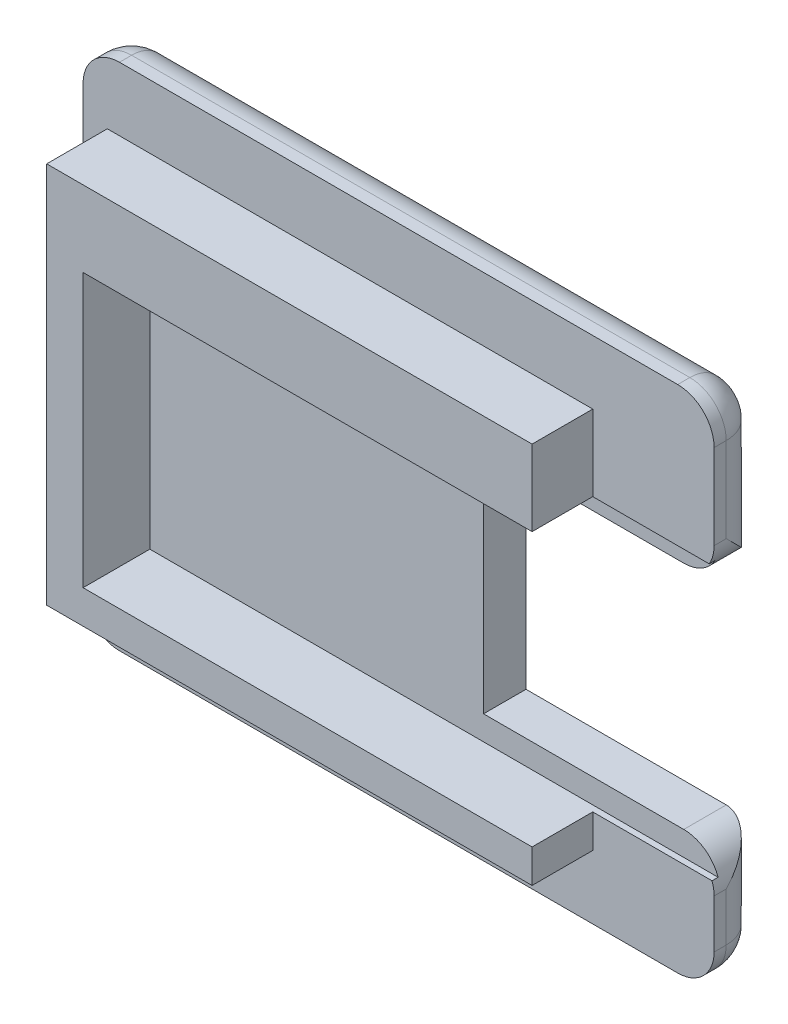
ISO-10303-21;
HEADER;
FILE_DESCRIPTION(('STEP AP214'),'2;1');
FILE_NAME('part.step','',(''),(''),'','','');
FILE_SCHEMA(('AUTOMOTIVE_DESIGN { 1 0 10303 214 1 1 1 1 }'));
ENDSEC;
DATA;
#1=APPLICATION_CONTEXT('core data for automotive mechanical design processes');
#2=APPLICATION_PROTOCOL_DEFINITION('international standard','automotive_design',2000,#1);
#3=PRODUCT_CONTEXT('',#1,'mechanical');
#4=PRODUCT('Part','Part','',(#3));
#5=PRODUCT_RELATED_PRODUCT_CATEGORY('part','',(#4));
#6=PRODUCT_DEFINITION_FORMATION('','',#4);
#7=PRODUCT_DEFINITION_CONTEXT('part definition',#1,'design');
#8=PRODUCT_DEFINITION('design','',#6,#7);
#9=PRODUCT_DEFINITION_SHAPE('','',#8);
#10=(LENGTH_UNIT() NAMED_UNIT(*) SI_UNIT(.MILLI.,.METRE.));
#11=(NAMED_UNIT(*) PLANE_ANGLE_UNIT() SI_UNIT($,.RADIAN.));
#12=(NAMED_UNIT(*) SI_UNIT($,.STERADIAN.) SOLID_ANGLE_UNIT());
#13=UNCERTAINTY_MEASURE_WITH_UNIT(LENGTH_MEASURE(1.E-05),#10,'distance_accuracy_value','');
#14=(GEOMETRIC_REPRESENTATION_CONTEXT(3) GLOBAL_UNCERTAINTY_ASSIGNED_CONTEXT((#13)) GLOBAL_UNIT_ASSIGNED_CONTEXT((#10,
#11,#12)) REPRESENTATION_CONTEXT('',''));
#15=CARTESIAN_POINT('',(0.,0.,0.));
#16=DIRECTION('',(0.,0.,1.));
#17=DIRECTION('',(1.,0.,0.));
#18=AXIS2_PLACEMENT_3D('',#15,#16,#17);
#19=CARTESIAN_POINT('',(26.,21.,4.));
#20=DIRECTION('',(-1.,0.,0.));
#21=DIRECTION('',(0.,0.,1.));
#22=AXIS2_PLACEMENT_3D('',#19,#20,#21);
#23=PLANE('',#22);
#24=DIRECTION('',(0.,1.,0.));
#25=VECTOR('',#24,1.);
#26=CARTESIAN_POINT('',(26.,21.,3.));
#27=LINE('',#26,#25);
#28=CARTESIAN_POINT('',(26.,-18.,3.));
#29=VERTEX_POINT('',#28);
#30=CARTESIAN_POINT('',(26.,-14.,3.));
#31=VERTEX_POINT('',#30);
#32=EDGE_CURVE('E364',#29,#31,#27,.T.);
#33=ORIENTED_EDGE('',*,*,#32,.T.);
#34=DIRECTION('',(0.,0.,1.));
#35=VECTOR('',#34,1.);
#36=CARTESIAN_POINT('',(26.,-14.,4.));
#37=LINE('',#36,#35);
#38=CARTESIAN_POINT('',(26.,-14.,4.));
#39=VERTEX_POINT('',#38);
#40=EDGE_CURVE('E366',#31,#39,#37,.T.);
#41=ORIENTED_EDGE('',*,*,#40,.T.);
#42=DIRECTION('',(0.,1.,0.));
#43=VECTOR('',#42,1.);
#44=CARTESIAN_POINT('',(26.,21.,4.));
#45=LINE('',#44,#43);
#46=CARTESIAN_POINT('',(26.,-18.,4.));
#47=VERTEX_POINT('',#46);
#48=EDGE_CURVE('E313',#47,#39,#45,.T.);
#49=ORIENTED_EDGE('',*,*,#48,.F.);
#50=DIRECTION('',(0.,0.,-1.));
#51=VECTOR('',#50,1.);
#52=CARTESIAN_POINT('',(26.,-18.,4.));
#53=LINE('',#52,#51);
#54=EDGE_CURVE('E362',#47,#29,#53,.T.);
#55=ORIENTED_EDGE('',*,*,#54,.T.);
#56=EDGE_LOOP('',(#33,#41,#49,#55));
#57=FACE_BOUND('',#56,.T.);
#58=ADVANCED_FACE('F41',(#57),#23,.F.);
#59=CARTESIAN_POINT('',(16.,15.75,9.));
#60=DIRECTION('',(-1.,0.,0.));
#61=DIRECTION('',(0.,-1.,0.));
#62=AXIS2_PLACEMENT_3D('',#59,#60,#61);
#63=PLANE('',#62);
#64=DIRECTION('',(0.,1.,0.));
#65=VECTOR('',#64,1.);
#66=CARTESIAN_POINT('',(16.,15.75,4.));
#67=LINE('',#66,#65);
#68=CARTESIAN_POINT('',(16.,-15.75,4.));
#69=VERTEX_POINT('',#68);
#70=CARTESIAN_POINT('',(16.,-13.,4.));
#71=VERTEX_POINT('',#70);
#72=EDGE_CURVE('E289',#69,#71,#67,.T.);
#73=ORIENTED_EDGE('',*,*,#72,.T.);
#74=DIRECTION('',(0.,0.,1.));
#75=VECTOR('',#74,1.);
#76=CARTESIAN_POINT('',(16.,-13.,9.));
#77=LINE('',#76,#75);
#78=CARTESIAN_POINT('',(16.,-13.,9.));
#79=VERTEX_POINT('',#78);
#80=EDGE_CURVE('E271',#71,#79,#77,.T.);
#81=ORIENTED_EDGE('',*,*,#80,.T.);
#82=DIRECTION('',(0.,1.,0.));
#83=VECTOR('',#82,1.);
#84=CARTESIAN_POINT('',(16.,15.75,9.));
#85=LINE('',#84,#83);
#86=CARTESIAN_POINT('',(16.,-15.75,9.));
#87=VERTEX_POINT('',#86);
#88=EDGE_CURVE('E278',#87,#79,#85,.T.);
#89=ORIENTED_EDGE('',*,*,#88,.F.);
#90=DIRECTION('',(0.,0.,-1.));
#91=VECTOR('',#90,1.);
#92=CARTESIAN_POINT('',(16.,-15.75,9.));
#93=LINE('',#92,#91);
#94=EDGE_CURVE('E288',#87,#69,#93,.T.);
#95=ORIENTED_EDGE('',*,*,#94,.T.);
#96=EDGE_LOOP('',(#73,#81,#89,#95));
#97=FACE_BOUND('',#96,.T.);
#98=ADVANCED_FACE('F478',(#97),#63,.F.);
#99=DIRECTION('',(0.,1.,0.));
#100=VECTOR('',#99,1.);
#101=CARTESIAN_POINT('',(26.,21.,3.));
#102=LINE('',#101,#100);
#103=CARTESIAN_POINT('',(26.,11.,3.));
#104=VERTEX_POINT('',#103);
#105=CARTESIAN_POINT('',(26.,18.,3.));
#106=VERTEX_POINT('',#105);
#107=EDGE_CURVE('E336',#104,#106,#102,.T.);
#108=ORIENTED_EDGE('',*,*,#107,.T.);
#109=DIRECTION('',(0.,0.,-1.));
#110=VECTOR('',#109,1.);
#111=CARTESIAN_POINT('',(26.,18.,4.));
#112=LINE('',#111,#110);
#113=CARTESIAN_POINT('',(26.,18.,4.));
#114=VERTEX_POINT('',#113);
#115=EDGE_CURVE('E338',#106,#114,#112,.F.);
#116=ORIENTED_EDGE('',*,*,#115,.T.);
#117=CARTESIAN_POINT('',(26.,11.,4.));
#118=VERTEX_POINT('',#117);
#119=EDGE_CURVE('E312',#118,#114,#45,.T.);
#120=ORIENTED_EDGE('',*,*,#119,.F.);
#121=DIRECTION('',(0.,0.,1.));
#122=VECTOR('',#121,1.);
#123=CARTESIAN_POINT('',(26.,11.,4.));
#124=LINE('',#123,#122);
#125=EDGE_CURVE('E334',#118,#104,#124,.F.);
#126=ORIENTED_EDGE('',*,*,#125,.T.);
#127=EDGE_LOOP('',(#108,#116,#120,#126));
#128=FACE_BOUND('',#127,.T.);
#129=ADVANCED_FACE('F480',(#128),#23,.F.);
#130=CARTESIAN_POINT('',(-26.,21.,4.));
#131=DIRECTION('',(0.,-1.,0.));
#132=DIRECTION('',(0.,0.,-1.));
#133=AXIS2_PLACEMENT_3D('',#130,#131,#132);
#134=PLANE('',#133);
#135=DIRECTION('',(-1.,0.,0.));
#136=VECTOR('',#135,1.);
#137=CARTESIAN_POINT('',(-26.,21.,4.));
#138=LINE('',#137,#136);
#139=CARTESIAN_POINT('',(23.,21.,4.));
#140=VERTEX_POINT('',#139);
#141=CARTESIAN_POINT('',(-23.,21.,4.));
#142=VERTEX_POINT('',#141);
#143=EDGE_CURVE('E316',#140,#142,#138,.T.);
#144=ORIENTED_EDGE('',*,*,#143,.F.);
#145=DIRECTION('',(0.,0.,-1.));
#146=VECTOR('',#145,1.);
#147=CARTESIAN_POINT('',(23.,21.,4.));
#148=LINE('',#147,#146);
#149=CARTESIAN_POINT('',(23.,21.,3.));
#150=VERTEX_POINT('',#149);
#151=EDGE_CURVE('E331',#140,#150,#148,.T.);
#152=ORIENTED_EDGE('',*,*,#151,.T.);
#153=DIRECTION('',(-1.,0.,0.));
#154=VECTOR('',#153,1.);
#155=CARTESIAN_POINT('',(-26.,21.,3.));
#156=LINE('',#155,#154);
#157=CARTESIAN_POINT('',(-23.,21.,3.));
#158=VERTEX_POINT('',#157);
#159=EDGE_CURVE('E329',#150,#158,#156,.T.);
#160=ORIENTED_EDGE('',*,*,#159,.T.);
#161=DIRECTION('',(0.,0.,-1.));
#162=VECTOR('',#161,1.);
#163=CARTESIAN_POINT('',(-23.,21.,4.));
#164=LINE('',#163,#162);
#165=EDGE_CURVE('E327',#158,#142,#164,.F.);
#166=ORIENTED_EDGE('',*,*,#165,.T.);
#167=EDGE_LOOP('',(#144,#152,#160,#166));
#168=FACE_BOUND('',#167,.T.);
#169=ADVANCED_FACE('F490',(#168),#134,.F.);
#170=CARTESIAN_POINT('',(-26.,21.,4.));
#171=DIRECTION('',(1.,0.,0.));
#172=DIRECTION('',(0.,1.,0.));
#173=AXIS2_PLACEMENT_3D('',#170,#171,#172);
#174=PLANE('',#173);
#175=DIRECTION('',(0.,-1.,0.));
#176=VECTOR('',#175,1.);
#177=CARTESIAN_POINT('',(-26.,21.,3.));
#178=LINE('',#177,#176);
#179=CARTESIAN_POINT('',(-26.,18.,3.));
#180=VERTEX_POINT('',#179);
#181=CARTESIAN_POINT('',(-26.,-18.,3.));
#182=VERTEX_POINT('',#181);
#183=EDGE_CURVE('E50',#180,#182,#178,.T.);
#184=ORIENTED_EDGE('',*,*,#183,.T.);
#185=DIRECTION('',(0.,0.,-1.));
#186=VECTOR('',#185,1.);
#187=CARTESIAN_POINT('',(-26.,-18.,4.));
#188=LINE('',#187,#186);
#189=CARTESIAN_POINT('',(-26.,-18.,4.));
#190=VERTEX_POINT('',#189);
#191=EDGE_CURVE('E11',#182,#190,#188,.F.);
#192=ORIENTED_EDGE('',*,*,#191,.T.);
#193=DIRECTION('',(0.,-1.,0.));
#194=VECTOR('',#193,1.);
#195=CARTESIAN_POINT('',(-26.,21.,4.));
#196=LINE('',#195,#194);
#197=CARTESIAN_POINT('',(-26.,18.,4.));
#198=VERTEX_POINT('',#197);
#199=EDGE_CURVE('E319',#198,#190,#196,.T.);
#200=ORIENTED_EDGE('',*,*,#199,.F.);
#201=DIRECTION('',(0.,0.,-1.));
#202=VECTOR('',#201,1.);
#203=CARTESIAN_POINT('',(-26.,18.,4.));
#204=LINE('',#203,#202);
#205=EDGE_CURVE('E61',#198,#180,#204,.T.);
#206=ORIENTED_EDGE('',*,*,#205,.T.);
#207=EDGE_LOOP('',(#184,#192,#200,#206));
#208=FACE_BOUND('',#207,.T.);
#209=ADVANCED_FACE('F495',(#208),#174,.F.);
#210=CARTESIAN_POINT('',(-26.,-21.,4.));
#211=DIRECTION('',(0.,1.,0.));
#212=DIRECTION('',(0.,0.,1.));
#213=AXIS2_PLACEMENT_3D('',#210,#211,#212);
#214=PLANE('',#213);
#215=DIRECTION('',(1.,0.,0.));
#216=VECTOR('',#215,1.);
#217=CARTESIAN_POINT('',(-26.,-21.,3.));
#218=LINE('',#217,#216);
#219=CARTESIAN_POINT('',(-23.,-21.,3.));
#220=VERTEX_POINT('',#219);
#221=CARTESIAN_POINT('',(23.,-21.,3.));
#222=VERTEX_POINT('',#221);
#223=EDGE_CURVE('E379',#220,#222,#218,.T.);
#224=ORIENTED_EDGE('',*,*,#223,.T.);
#225=DIRECTION('',(0.,0.,-1.));
#226=VECTOR('',#225,1.);
#227=CARTESIAN_POINT('',(23.,-21.,4.));
#228=LINE('',#227,#226);
#229=CARTESIAN_POINT('',(23.,-21.,4.));
#230=VERTEX_POINT('',#229);
#231=EDGE_CURVE('E383',#222,#230,#228,.F.);
#232=ORIENTED_EDGE('',*,*,#231,.T.);
#233=DIRECTION('',(1.,0.,0.));
#234=VECTOR('',#233,1.);
#235=CARTESIAN_POINT('',(-26.,-21.,4.));
#236=LINE('',#235,#234);
#237=CARTESIAN_POINT('',(-23.,-21.,4.));
#238=VERTEX_POINT('',#237);
#239=EDGE_CURVE('E322',#238,#230,#236,.T.);
#240=ORIENTED_EDGE('',*,*,#239,.F.);
#241=DIRECTION('',(0.,0.,-1.));
#242=VECTOR('',#241,1.);
#243=CARTESIAN_POINT('',(-23.,-21.,4.));
#244=LINE('',#243,#242);
#245=EDGE_CURVE('E381',#238,#220,#244,.T.);
#246=ORIENTED_EDGE('',*,*,#245,.T.);
#247=EDGE_LOOP('',(#224,#232,#240,#246));
#248=FACE_BOUND('',#247,.T.);
#249=ADVANCED_FACE('F537',(#248),#214,.F.);
#250=CARTESIAN_POINT('',(0.,0.,4.));
#251=DIRECTION('',(0.,0.,1.));
#252=DIRECTION('',(1.,0.,0.));
#253=AXIS2_PLACEMENT_3D('',#250,#251,#252);
#254=PLANE('',#253);
#255=ORIENTED_EDGE('',*,*,#119,.T.);
#256=CARTESIAN_POINT('',(23.,18.,4.));
#257=DIRECTION('',(0.,0.,1.));
#258=DIRECTION('',(1.,0.,0.));
#259=AXIS2_PLACEMENT_3D('',#256,#257,#258);
#260=CIRCLE('',#259,3.);
#261=EDGE_CURVE('E350',#114,#140,#260,.T.);
#262=ORIENTED_EDGE('',*,*,#261,.T.);
#263=ORIENTED_EDGE('',*,*,#143,.T.);
#264=CARTESIAN_POINT('',(-23.,18.,4.));
#265=DIRECTION('',(0.,0.,1.));
#266=DIRECTION('',(1.,0.,0.));
#267=AXIS2_PLACEMENT_3D('',#264,#265,#266);
#268=CIRCLE('',#267,3.);
#269=EDGE_CURVE('E340',#142,#198,#268,.T.);
#270=ORIENTED_EDGE('',*,*,#269,.T.);
#271=ORIENTED_EDGE('',*,*,#199,.T.);
#272=CARTESIAN_POINT('',(-23.,-18.,4.));
#273=DIRECTION('',(0.,0.,1.));
#274=DIRECTION('',(1.,0.,0.));
#275=AXIS2_PLACEMENT_3D('',#272,#273,#274);
#276=CIRCLE('',#275,3.);
#277=EDGE_CURVE('E342',#190,#238,#276,.T.);
#278=ORIENTED_EDGE('',*,*,#277,.T.);
#279=ORIENTED_EDGE('',*,*,#239,.T.);
#280=CARTESIAN_POINT('',(23.,-18.,4.));
#281=DIRECTION('',(0.,0.,1.));
#282=DIRECTION('',(1.,0.,0.));
#283=AXIS2_PLACEMENT_3D('',#280,#281,#282);
#284=CIRCLE('',#283,3.);
#285=EDGE_CURVE('E344',#230,#47,#284,.T.);
#286=ORIENTED_EDGE('',*,*,#285,.T.);
#287=ORIENTED_EDGE('',*,*,#48,.T.);
#288=CARTESIAN_POINT('',(23.,-14.,4.));
#289=DIRECTION('',(0.,0.,1.));
#290=DIRECTION('',(1.,0.,0.));
#291=AXIS2_PLACEMENT_3D('',#288,#289,#290);
#292=CIRCLE('',#291,3.);
#293=CARTESIAN_POINT('',(25.8284271247462,-13.,4.));
#294=VERTEX_POINT('',#293);
#295=EDGE_CURVE('E346',#39,#294,#292,.T.);
#296=ORIENTED_EDGE('',*,*,#295,.T.);
#297=DIRECTION('',(1.,0.,0.));
#298=VECTOR('',#297,1.);
#299=CARTESIAN_POINT('',(0.,-13.,4.));
#300=LINE('',#299,#298);
#301=EDGE_CURVE('E274',#71,#294,#300,.T.);
#302=ORIENTED_EDGE('',*,*,#301,.F.);
#303=ORIENTED_EDGE('',*,*,#72,.F.);
#304=DIRECTION('',(1.,0.,0.));
#305=VECTOR('',#304,1.);
#306=CARTESIAN_POINT('',(-24.,-15.75,4.));
#307=LINE('',#306,#305);
#308=CARTESIAN_POINT('',(-24.,-15.75,4.));
#309=VERTEX_POINT('',#308);
#310=EDGE_CURVE('E298',#309,#69,#307,.T.);
#311=ORIENTED_EDGE('',*,*,#310,.F.);
#312=DIRECTION('',(0.,-1.,0.));
#313=VECTOR('',#312,1.);
#314=CARTESIAN_POINT('',(-24.,15.75,4.));
#315=LINE('',#314,#313);
#316=CARTESIAN_POINT('',(-24.,15.75,4.));
#317=VERTEX_POINT('',#316);
#318=EDGE_CURVE('E295',#317,#309,#315,.T.);
#319=ORIENTED_EDGE('',*,*,#318,.F.);
#320=DIRECTION('',(-1.,0.,0.));
#321=VECTOR('',#320,1.);
#322=CARTESIAN_POINT('',(-24.,15.75,4.));
#323=LINE('',#322,#321);
#324=CARTESIAN_POINT('',(16.,15.75,4.));
#325=VERTEX_POINT('',#324);
#326=EDGE_CURVE('E292',#325,#317,#323,.T.);
#327=ORIENTED_EDGE('',*,*,#326,.F.);
#328=CARTESIAN_POINT('',(16.,9.5,4.));
#329=VERTEX_POINT('',#328);
#330=EDGE_CURVE('E277',#329,#325,#67,.T.);
#331=ORIENTED_EDGE('',*,*,#330,.F.);
#332=DIRECTION('',(-1.,0.,0.));
#333=VECTOR('',#332,1.);
#334=CARTESIAN_POINT('',(0.,9.5,4.));
#335=LINE('',#334,#333);
#336=CARTESIAN_POINT('',(25.5980762113533,9.5,4.));
#337=VERTEX_POINT('',#336);
#338=EDGE_CURVE('E269',#337,#329,#335,.T.);
#339=ORIENTED_EDGE('',*,*,#338,.F.);
#340=CARTESIAN_POINT('',(23.,11.,4.));
#341=DIRECTION('',(0.,0.,1.));
#342=DIRECTION('',(1.,0.,0.));
#343=AXIS2_PLACEMENT_3D('',#340,#341,#342);
#344=CIRCLE('',#343,3.);
#345=EDGE_CURVE('E348',#337,#118,#344,.T.);
#346=ORIENTED_EDGE('',*,*,#345,.T.);
#347=EDGE_LOOP('',(#255,#262,#263,#270,#271,#278,#279,#286,#287,#296,#302,#303,#311,#319,#327,
#331,#339,#346));
#348=FACE_BOUND('',#347,.T.);
#349=ADVANCED_FACE('F444',(#348),#254,.T.);
#350=CARTESIAN_POINT('',(0.,0.,0.));
#351=DIRECTION('',(0.,0.,1.));
#352=DIRECTION('',(1.,0.,0.));
#353=AXIS2_PLACEMENT_3D('',#350,#351,#352);
#354=PLANE('',#353);
#355=DIRECTION('',(-1.,0.,0.));
#356=VECTOR('',#355,1.);
#357=CARTESIAN_POINT('',(0.,18.,0.));
#358=LINE('',#357,#356);
#359=CARTESIAN_POINT('',(-23.,18.,0.));
#360=VERTEX_POINT('',#359);
#361=CARTESIAN_POINT('',(23.,18.,0.));
#362=VERTEX_POINT('',#361);
#363=EDGE_CURVE('E358',#360,#362,#358,.F.);
#364=ORIENTED_EDGE('',*,*,#363,.T.);
#365=DIRECTION('',(0.,1.,0.));
#366=VECTOR('',#365,1.);
#367=CARTESIAN_POINT('',(23.,0.,0.));
#368=LINE('',#367,#366);
#369=CARTESIAN_POINT('',(23.,8.,0.));
#370=VERTEX_POINT('',#369);
#371=EDGE_CURVE('E360',#362,#370,#368,.F.);
#372=ORIENTED_EDGE('',*,*,#371,.T.);
#373=DIRECTION('',(-1.,0.,0.));
#374=VECTOR('',#373,1.);
#375=CARTESIAN_POINT('',(0.,8.,0.));
#376=LINE('',#375,#374);
#377=CARTESIAN_POINT('',(6.50000000000001,8.,0.));
#378=VERTEX_POINT('',#377);
#379=EDGE_CURVE('E241',#370,#378,#376,.T.);
#380=ORIENTED_EDGE('',*,*,#379,.T.);
#381=DIRECTION('',(0.,-1.,0.));
#382=VECTOR('',#381,1.);
#383=CARTESIAN_POINT('',(6.50000000000001,0.,0.));
#384=LINE('',#383,#382);
#385=CARTESIAN_POINT('',(6.50000000000001,-11.,0.));
#386=VERTEX_POINT('',#385);
#387=EDGE_CURVE('E232',#378,#386,#384,.T.);
#388=ORIENTED_EDGE('',*,*,#387,.T.);
#389=DIRECTION('',(1.,0.,0.));
#390=VECTOR('',#389,1.);
#391=CARTESIAN_POINT('',(0.,-11.,0.));
#392=LINE('',#391,#390);
#393=CARTESIAN_POINT('',(23.,-11.,0.));
#394=VERTEX_POINT('',#393);
#395=EDGE_CURVE('E245',#386,#394,#392,.T.);
#396=ORIENTED_EDGE('',*,*,#395,.T.);
#397=DIRECTION('',(0.,1.,0.));
#398=VECTOR('',#397,1.);
#399=CARTESIAN_POINT('',(23.,0.,0.));
#400=LINE('',#399,#398);
#401=CARTESIAN_POINT('',(23.,-18.,0.));
#402=VERTEX_POINT('',#401);
#403=EDGE_CURVE('E356',#394,#402,#400,.F.);
#404=ORIENTED_EDGE('',*,*,#403,.T.);
#405=DIRECTION('',(1.,0.,0.));
#406=VECTOR('',#405,1.);
#407=CARTESIAN_POINT('',(0.,-18.,0.));
#408=LINE('',#407,#406);
#409=CARTESIAN_POINT('',(-23.,-18.,0.));
#410=VERTEX_POINT('',#409);
#411=EDGE_CURVE('E354',#402,#410,#408,.F.);
#412=ORIENTED_EDGE('',*,*,#411,.T.);
#413=DIRECTION('',(0.,-1.,0.));
#414=VECTOR('',#413,1.);
#415=CARTESIAN_POINT('',(-23.,0.,0.));
#416=LINE('',#415,#414);
#417=EDGE_CURVE('E352',#410,#360,#416,.F.);
#418=ORIENTED_EDGE('',*,*,#417,.T.);
#419=EDGE_LOOP('',(#364,#372,#380,#388,#396,#404,#412,#418));
#420=FACE_BOUND('',#419,.T.);
#421=ADVANCED_FACE('F459',(#420),#354,.F.);
#422=CARTESIAN_POINT('',(16.,9.5,9.));
#423=VERTEX_POINT('',#422);
#424=CARTESIAN_POINT('',(16.,15.75,9.));
#425=VERTEX_POINT('',#424);
#426=EDGE_CURVE('E282',#423,#425,#85,.T.);
#427=ORIENTED_EDGE('',*,*,#426,.F.);
#428=DIRECTION('',(0.,0.,-1.));
#429=VECTOR('',#428,1.);
#430=CARTESIAN_POINT('',(16.,9.5,9.));
#431=LINE('',#430,#429);
#432=EDGE_CURVE('E264',#423,#329,#431,.T.);
#433=ORIENTED_EDGE('',*,*,#432,.T.);
#434=ORIENTED_EDGE('',*,*,#330,.T.);
#435=DIRECTION('',(0.,0.,-1.));
#436=VECTOR('',#435,1.);
#437=CARTESIAN_POINT('',(16.,15.75,9.));
#438=LINE('',#437,#436);
#439=EDGE_CURVE('E309',#425,#325,#438,.T.);
#440=ORIENTED_EDGE('',*,*,#439,.F.);
#441=EDGE_LOOP('',(#427,#433,#434,#440));
#442=FACE_BOUND('',#441,.T.);
#443=ADVANCED_FACE('F487',(#442),#63,.F.);
#444=CARTESIAN_POINT('',(-24.,15.75,9.));
#445=DIRECTION('',(0.,-1.,0.));
#446=DIRECTION('',(0.,0.,-1.));
#447=AXIS2_PLACEMENT_3D('',#444,#445,#446);
#448=PLANE('',#447);
#449=ORIENTED_EDGE('',*,*,#326,.T.);
#450=DIRECTION('',(0.,0.,-1.));
#451=VECTOR('',#450,1.);
#452=CARTESIAN_POINT('',(-24.,15.75,9.));
#453=LINE('',#452,#451);
#454=CARTESIAN_POINT('',(-24.,15.75,9.));
#455=VERTEX_POINT('',#454);
#456=EDGE_CURVE('E306',#455,#317,#453,.T.);
#457=ORIENTED_EDGE('',*,*,#456,.F.);
#458=DIRECTION('',(-1.,0.,0.));
#459=VECTOR('',#458,1.);
#460=CARTESIAN_POINT('',(-24.,15.75,9.));
#461=LINE('',#460,#459);
#462=EDGE_CURVE('E281',#425,#455,#461,.T.);
#463=ORIENTED_EDGE('',*,*,#462,.F.);
#464=ORIENTED_EDGE('',*,*,#439,.T.);
#465=EDGE_LOOP('',(#449,#457,#463,#464));
#466=FACE_BOUND('',#465,.T.);
#467=ADVANCED_FACE('F550',(#466),#448,.F.);
#468=CARTESIAN_POINT('',(-24.,15.75,9.));
#469=DIRECTION('',(1.,0.,0.));
#470=DIRECTION('',(0.,1.,0.));
#471=AXIS2_PLACEMENT_3D('',#468,#469,#470);
#472=PLANE('',#471);
#473=ORIENTED_EDGE('',*,*,#318,.T.);
#474=DIRECTION('',(0.,0.,-1.));
#475=VECTOR('',#474,1.);
#476=CARTESIAN_POINT('',(-24.,-15.75,9.));
#477=LINE('',#476,#475);
#478=CARTESIAN_POINT('',(-24.,-15.75,9.));
#479=VERTEX_POINT('',#478);
#480=EDGE_CURVE('E303',#479,#309,#477,.T.);
#481=ORIENTED_EDGE('',*,*,#480,.F.);
#482=DIRECTION('',(0.,-1.,0.));
#483=VECTOR('',#482,1.);
#484=CARTESIAN_POINT('',(-24.,15.75,9.));
#485=LINE('',#484,#483);
#486=EDGE_CURVE('E284',#455,#479,#485,.T.);
#487=ORIENTED_EDGE('',*,*,#486,.F.);
#488=ORIENTED_EDGE('',*,*,#456,.T.);
#489=EDGE_LOOP('',(#473,#481,#487,#488));
#490=FACE_BOUND('',#489,.T.);
#491=ADVANCED_FACE('F554',(#490),#472,.F.);
#492=CARTESIAN_POINT('',(-24.,-15.75,9.));
#493=DIRECTION('',(0.,1.,0.));
#494=DIRECTION('',(0.,0.,1.));
#495=AXIS2_PLACEMENT_3D('',#492,#493,#494);
#496=PLANE('',#495);
#497=ORIENTED_EDGE('',*,*,#310,.T.);
#498=ORIENTED_EDGE('',*,*,#94,.F.);
#499=DIRECTION('',(1.,0.,0.));
#500=VECTOR('',#499,1.);
#501=CARTESIAN_POINT('',(-24.,-15.75,9.));
#502=LINE('',#501,#500);
#503=EDGE_CURVE('E286',#479,#87,#502,.T.);
#504=ORIENTED_EDGE('',*,*,#503,.F.);
#505=ORIENTED_EDGE('',*,*,#480,.T.);
#506=EDGE_LOOP('',(#497,#498,#504,#505));
#507=FACE_BOUND('',#506,.T.);
#508=ADVANCED_FACE('F558',(#507),#496,.F.);
#509=CARTESIAN_POINT('',(0.,0.,9.));
#510=DIRECTION('',(0.,0.,1.));
#511=DIRECTION('',(1.,0.,0.));
#512=AXIS2_PLACEMENT_3D('',#509,#510,#511);
#513=PLANE('',#512);
#514=DIRECTION('',(1.,0.,0.));
#515=VECTOR('',#514,1.);
#516=CARTESIAN_POINT('',(-21.,-13.,9.));
#517=LINE('',#516,#515);
#518=CARTESIAN_POINT('',(-21.,-13.,9.));
#519=VERTEX_POINT('',#518);
#520=EDGE_CURVE('E252',#519,#79,#517,.T.);
#521=ORIENTED_EDGE('',*,*,#520,.F.);
#522=DIRECTION('',(0.,-1.,0.));
#523=VECTOR('',#522,1.);
#524=CARTESIAN_POINT('',(-21.,9.5,9.));
#525=LINE('',#524,#523);
#526=CARTESIAN_POINT('',(-21.,9.5,9.));
#527=VERTEX_POINT('',#526);
#528=EDGE_CURVE('E248',#527,#519,#525,.T.);
#529=ORIENTED_EDGE('',*,*,#528,.F.);
#530=DIRECTION('',(-1.,0.,0.));
#531=VECTOR('',#530,1.);
#532=CARTESIAN_POINT('',(0.,9.5,9.));
#533=LINE('',#532,#531);
#534=EDGE_CURVE('E325',#423,#527,#533,.T.);
#535=ORIENTED_EDGE('',*,*,#534,.F.);
#536=ORIENTED_EDGE('',*,*,#426,.T.);
#537=ORIENTED_EDGE('',*,*,#462,.T.);
#538=ORIENTED_EDGE('',*,*,#486,.T.);
#539=ORIENTED_EDGE('',*,*,#503,.T.);
#540=ORIENTED_EDGE('',*,*,#88,.T.);
#541=EDGE_LOOP('',(#521,#529,#535,#536,#537,#538,#539,#540));
#542=FACE_BOUND('',#541,.T.);
#543=ADVANCED_FACE('F562',(#542),#513,.T.);
#544=CARTESIAN_POINT('',(0.,0.,3.5));
#545=DIRECTION('',(0.,0.,1.));
#546=DIRECTION('',(1.,0.,0.));
#547=AXIS2_PLACEMENT_3D('',#544,#545,#546);
#548=PLANE('',#547);
#549=DIRECTION('',(-1.,0.,0.));
#550=VECTOR('',#549,1.);
#551=CARTESIAN_POINT('',(6.50000000000001,8.,3.5));
#552=LINE('',#551,#550);
#553=CARTESIAN_POINT('',(23.,8.,3.5));
#554=VERTEX_POINT('',#553);
#555=CARTESIAN_POINT('',(6.50000000000001,8.,3.5));
#556=VERTEX_POINT('',#555);
#557=EDGE_CURVE('E213',#554,#556,#552,.T.);
#558=ORIENTED_EDGE('',*,*,#557,.F.);
#559=CARTESIAN_POINT('',(23.,11.,3.5));
#560=DIRECTION('',(0.,0.,1.));
#561=DIRECTION('',(1.,0.,0.));
#562=AXIS2_PLACEMENT_3D('',#559,#560,#561);
#563=CIRCLE('',#562,3.);
#564=CARTESIAN_POINT('',(25.5980762113533,9.5,3.5));
#565=VERTEX_POINT('',#564);
#566=EDGE_CURVE('E371',#554,#565,#563,.T.);
#567=ORIENTED_EDGE('',*,*,#566,.T.);
#568=DIRECTION('',(-1.,0.,0.));
#569=VECTOR('',#568,1.);
#570=CARTESIAN_POINT('',(-21.,9.5,3.5));
#571=LINE('',#570,#569);
#572=CARTESIAN_POINT('',(-21.,9.5,3.5));
#573=VERTEX_POINT('',#572);
#574=EDGE_CURVE('E249',#565,#573,#571,.T.);
#575=ORIENTED_EDGE('',*,*,#574,.T.);
#576=DIRECTION('',(0.,-1.,0.));
#577=VECTOR('',#576,1.);
#578=CARTESIAN_POINT('',(-21.,9.5,3.5));
#579=LINE('',#578,#577);
#580=CARTESIAN_POINT('',(-21.,-13.,3.5));
#581=VERTEX_POINT('',#580);
#582=EDGE_CURVE('E251',#573,#581,#579,.T.);
#583=ORIENTED_EDGE('',*,*,#582,.T.);
#584=DIRECTION('',(1.,0.,0.));
#585=VECTOR('',#584,1.);
#586=CARTESIAN_POINT('',(-21.,-13.,3.5));
#587=LINE('',#586,#585);
#588=CARTESIAN_POINT('',(25.8284271247462,-13.,3.5));
#589=VERTEX_POINT('',#588);
#590=EDGE_CURVE('E255',#581,#589,#587,.T.);
#591=ORIENTED_EDGE('',*,*,#590,.T.);
#592=CARTESIAN_POINT('',(23.,-14.,3.5));
#593=DIRECTION('',(0.,0.,1.));
#594=DIRECTION('',(1.,0.,0.));
#595=AXIS2_PLACEMENT_3D('',#592,#593,#594);
#596=CIRCLE('',#595,3.);
#597=CARTESIAN_POINT('',(23.,-11.,3.5));
#598=VERTEX_POINT('',#597);
#599=EDGE_CURVE('E369',#589,#598,#596,.T.);
#600=ORIENTED_EDGE('',*,*,#599,.T.);
#601=DIRECTION('',(1.,0.,0.));
#602=VECTOR('',#601,1.);
#603=CARTESIAN_POINT('',(6.50000000000001,-11.,3.5));
#604=LINE('',#603,#602);
#605=CARTESIAN_POINT('',(6.50000000000001,-11.,3.5));
#606=VERTEX_POINT('',#605);
#607=EDGE_CURVE('E234',#606,#598,#604,.T.);
#608=ORIENTED_EDGE('',*,*,#607,.F.);
#609=DIRECTION('',(0.,-1.,0.));
#610=VECTOR('',#609,1.);
#611=CARTESIAN_POINT('',(6.50000000000001,8.,3.5));
#612=LINE('',#611,#610);
#613=EDGE_CURVE('E223',#556,#606,#612,.T.);
#614=ORIENTED_EDGE('',*,*,#613,.F.);
#615=EDGE_LOOP('',(#558,#567,#575,#583,#591,#600,#608,#614));
#616=FACE_BOUND('',#615,.T.);
#617=ADVANCED_FACE('F236',(#616),#548,.T.);
#618=CARTESIAN_POINT('',(-21.,-13.,3.5));
#619=DIRECTION('',(0.,-1.,0.));
#620=DIRECTION('',(0.,0.,-1.));
#621=AXIS2_PLACEMENT_3D('',#618,#619,#620);
#622=PLANE('',#621);
#623=ORIENTED_EDGE('',*,*,#301,.T.);
#624=DIRECTION('',(0.,0.,1.));
#625=VECTOR('',#624,1.);
#626=CARTESIAN_POINT('',(25.8284271247462,-13.,4.));
#627=LINE('',#626,#625);
#628=EDGE_CURVE('E375',#294,#589,#627,.F.);
#629=ORIENTED_EDGE('',*,*,#628,.T.);
#630=ORIENTED_EDGE('',*,*,#590,.F.);
#631=DIRECTION('',(0.,0.,1.));
#632=VECTOR('',#631,1.);
#633=CARTESIAN_POINT('',(-21.,-13.,3.5));
#634=LINE('',#633,#632);
#635=EDGE_CURVE('E262',#581,#519,#634,.T.);
#636=ORIENTED_EDGE('',*,*,#635,.T.);
#637=ORIENTED_EDGE('',*,*,#520,.T.);
#638=ORIENTED_EDGE('',*,*,#80,.F.);
#639=EDGE_LOOP('',(#623,#629,#630,#636,#637,#638));
#640=FACE_BOUND('',#639,.T.);
#641=ADVANCED_FACE('F567',(#640),#622,.F.);
#642=CARTESIAN_POINT('',(-21.,9.5,3.5));
#643=DIRECTION('',(0.,1.,0.));
#644=DIRECTION('',(0.,0.,1.));
#645=AXIS2_PLACEMENT_3D('',#642,#643,#644);
#646=PLANE('',#645);
#647=ORIENTED_EDGE('',*,*,#574,.F.);
#648=DIRECTION('',(0.,0.,1.));
#649=VECTOR('',#648,1.);
#650=CARTESIAN_POINT('',(25.5980762113533,9.5,3.5));
#651=LINE('',#650,#649);
#652=EDGE_CURVE('E373',#565,#337,#651,.T.);
#653=ORIENTED_EDGE('',*,*,#652,.T.);
#654=ORIENTED_EDGE('',*,*,#338,.T.);
#655=ORIENTED_EDGE('',*,*,#432,.F.);
#656=ORIENTED_EDGE('',*,*,#534,.T.);
#657=DIRECTION('',(0.,0.,1.));
#658=VECTOR('',#657,1.);
#659=CARTESIAN_POINT('',(-21.,9.5,3.5));
#660=LINE('',#659,#658);
#661=EDGE_CURVE('E258',#573,#527,#660,.T.);
#662=ORIENTED_EDGE('',*,*,#661,.F.);
#663=EDGE_LOOP('',(#647,#653,#654,#655,#656,#662));
#664=FACE_BOUND('',#663,.T.);
#665=ADVANCED_FACE('F474',(#664),#646,.F.);
#666=CARTESIAN_POINT('',(-21.,9.5,3.5));
#667=DIRECTION('',(-1.,0.,0.));
#668=DIRECTION('',(0.,-1.,0.));
#669=AXIS2_PLACEMENT_3D('',#666,#667,#668);
#670=PLANE('',#669);
#671=ORIENTED_EDGE('',*,*,#528,.T.);
#672=ORIENTED_EDGE('',*,*,#635,.F.);
#673=ORIENTED_EDGE('',*,*,#582,.F.);
#674=ORIENTED_EDGE('',*,*,#661,.T.);
#675=EDGE_LOOP('',(#671,#672,#673,#674));
#676=FACE_BOUND('',#675,.T.);
#677=ADVANCED_FACE('F465',(#676),#670,.F.);
#678=CARTESIAN_POINT('',(6.50000000000001,-11.,-6.5));
#679=DIRECTION('',(0.,-1.,0.));
#680=DIRECTION('',(0.,0.,-1.));
#681=AXIS2_PLACEMENT_3D('',#678,#679,#680);
#682=PLANE('',#681);
#683=ORIENTED_EDGE('',*,*,#607,.T.);
#684=DIRECTION('',(0.,0.,1.));
#685=VECTOR('',#684,1.);
#686=CARTESIAN_POINT('',(23.,-11.,-6.5));
#687=LINE('',#686,#685);
#688=EDGE_CURVE('E377',#598,#394,#687,.F.);
#689=ORIENTED_EDGE('',*,*,#688,.T.);
#690=ORIENTED_EDGE('',*,*,#395,.F.);
#691=DIRECTION('',(0.,0.,1.));
#692=VECTOR('',#691,1.);
#693=CARTESIAN_POINT('',(6.50000000000001,-11.,-6.5));
#694=LINE('',#693,#692);
#695=EDGE_CURVE('E233',#386,#606,#694,.T.);
#696=ORIENTED_EDGE('',*,*,#695,.T.);
#697=EDGE_LOOP('',(#683,#689,#690,#696));
#698=FACE_BOUND('',#697,.T.);
#699=ADVANCED_FACE('F463',(#698),#682,.F.);
#700=CARTESIAN_POINT('',(6.50000000000001,8.,-6.5));
#701=DIRECTION('',(-1.,0.,0.));
#702=DIRECTION('',(0.,-1.,0.));
#703=AXIS2_PLACEMENT_3D('',#700,#701,#702);
#704=PLANE('',#703);
#705=DIRECTION('',(0.,0.,1.));
#706=VECTOR('',#705,1.);
#707=CARTESIAN_POINT('',(6.50000000000001,8.,-6.5));
#708=LINE('',#707,#706);
#709=EDGE_CURVE('E217',#378,#556,#708,.T.);
#710=ORIENTED_EDGE('',*,*,#709,.T.);
#711=ORIENTED_EDGE('',*,*,#613,.T.);
#712=ORIENTED_EDGE('',*,*,#695,.F.);
#713=ORIENTED_EDGE('',*,*,#387,.F.);
#714=EDGE_LOOP('',(#710,#711,#712,#713));
#715=FACE_BOUND('',#714,.T.);
#716=ADVANCED_FACE('F228',(#715),#704,.F.);
#717=CARTESIAN_POINT('',(6.50000000000001,8.,-6.5));
#718=DIRECTION('',(0.,1.,0.));
#719=DIRECTION('',(0.,0.,1.));
#720=AXIS2_PLACEMENT_3D('',#717,#718,#719);
#721=PLANE('',#720);
#722=ORIENTED_EDGE('',*,*,#379,.F.);
#723=DIRECTION('',(0.,0.,1.));
#724=VECTOR('',#723,1.);
#725=CARTESIAN_POINT('',(23.,8.,-6.5));
#726=LINE('',#725,#724);
#727=EDGE_CURVE('E219',#370,#554,#726,.T.);
#728=ORIENTED_EDGE('',*,*,#727,.T.);
#729=ORIENTED_EDGE('',*,*,#557,.T.);
#730=ORIENTED_EDGE('',*,*,#709,.F.);
#731=EDGE_LOOP('',(#722,#728,#729,#730));
#732=FACE_BOUND('',#731,.T.);
#733=ADVANCED_FACE('F216',(#732),#721,.F.);
#734=CARTESIAN_POINT('',(23.,-14.,4.));
#735=DIRECTION('',(0.,0.,1.));
#736=DIRECTION('',(1.,0.,0.));
#737=AXIS2_PLACEMENT_3D('',#734,#735,#736);
#738=CYLINDRICAL_SURFACE('',#737,3.);
#739=ORIENTED_EDGE('',*,*,#295,.F.);
#740=ORIENTED_EDGE('',*,*,#40,.F.);
#741=CARTESIAN_POINT('',(23.,-14.,3.));
#742=DIRECTION('',(0.,0.707106781186547,0.707106781186547));
#743=DIRECTION('',(0.,-0.707106781186547,0.707106781186547));
#744=AXIS2_PLACEMENT_3D('',#741,#742,#743);
#745=ELLIPSE('',#744,4.24264068711928,3.);
#746=EDGE_CURVE('E45',#394,#31,#745,.F.);
#747=ORIENTED_EDGE('',*,*,#746,.F.);
#748=ORIENTED_EDGE('',*,*,#688,.F.);
#749=ORIENTED_EDGE('',*,*,#599,.F.);
#750=ORIENTED_EDGE('',*,*,#628,.F.);
#751=EDGE_LOOP('',(#739,#740,#747,#748,#749,#750));
#752=FACE_BOUND('',#751,.T.);
#753=ADVANCED_FACE('F43',(#752),#738,.T.);
#754=CARTESIAN_POINT('',(23.,-18.,4.));
#755=DIRECTION('',(0.,0.,-1.));
#756=DIRECTION('',(-1.,0.,0.));
#757=AXIS2_PLACEMENT_3D('',#754,#755,#756);
#758=CYLINDRICAL_SURFACE('',#757,3.);
#759=ORIENTED_EDGE('',*,*,#285,.F.);
#760=ORIENTED_EDGE('',*,*,#231,.F.);
#761=CARTESIAN_POINT('',(23.,-18.,3.));
#762=DIRECTION('',(0.,0.,-1.));
#763=DIRECTION('',(-1.,0.,0.));
#764=AXIS2_PLACEMENT_3D('',#761,#762,#763);
#765=CIRCLE('',#764,3.);
#766=EDGE_CURVE('E421',#29,#222,#765,.T.);
#767=ORIENTED_EDGE('',*,*,#766,.F.);
#768=ORIENTED_EDGE('',*,*,#54,.F.);
#769=EDGE_LOOP('',(#759,#760,#767,#768));
#770=FACE_BOUND('',#769,.T.);
#771=ADVANCED_FACE('F450',(#770),#758,.T.);
#772=CARTESIAN_POINT('',(23.,21.,3.));
#773=DIRECTION('',(0.,1.,0.));
#774=DIRECTION('',(0.,0.,1.));
#775=AXIS2_PLACEMENT_3D('',#772,#773,#774);
#776=CYLINDRICAL_SURFACE('',#775,3.);
#777=ORIENTED_EDGE('',*,*,#746,.T.);
#778=ORIENTED_EDGE('',*,*,#32,.F.);
#779=CARTESIAN_POINT('',(23.,-18.,3.));
#780=DIRECTION('',(0.,-1.,0.));
#781=DIRECTION('',(1.,0.,0.));
#782=AXIS2_PLACEMENT_3D('',#779,#780,#781);
#783=CIRCLE('',#782,3.);
#784=EDGE_CURVE('E419',#402,#29,#783,.T.);
#785=ORIENTED_EDGE('',*,*,#784,.F.);
#786=ORIENTED_EDGE('',*,*,#403,.F.);
#787=EDGE_LOOP('',(#777,#778,#785,#786));
#788=FACE_BOUND('',#787,.T.);
#789=ADVANCED_FACE('F431',(#788),#776,.T.);
#790=CARTESIAN_POINT('',(23.,-18.,3.));
#791=DIRECTION('',(1.,0.,0.));
#792=DIRECTION('',(0.,1.,0.));
#793=AXIS2_PLACEMENT_3D('',#790,#791,#792);
#794=SPHERICAL_SURFACE('',#793,3.);
#795=ORIENTED_EDGE('',*,*,#784,.T.);
#796=ORIENTED_EDGE('',*,*,#766,.T.);
#797=CARTESIAN_POINT('',(23.,-18.,3.));
#798=DIRECTION('',(1.,0.,0.));
#799=DIRECTION('',(0.,0.,-1.));
#800=AXIS2_PLACEMENT_3D('',#797,#798,#799);
#801=CIRCLE('',#800,3.);
#802=EDGE_CURVE('E416',#402,#222,#801,.F.);
#803=ORIENTED_EDGE('',*,*,#802,.F.);
#804=EDGE_LOOP('',(#795,#796,#803));
#805=FACE_BOUND('',#804,.T.);
#806=ADVANCED_FACE('F451',(#805),#794,.T.);
#807=CARTESIAN_POINT('',(-23.,-18.,4.));
#808=DIRECTION('',(0.,0.,-1.));
#809=DIRECTION('',(-1.,0.,0.));
#810=AXIS2_PLACEMENT_3D('',#807,#808,#809);
#811=CYLINDRICAL_SURFACE('',#810,3.);
#812=ORIENTED_EDGE('',*,*,#277,.F.);
#813=ORIENTED_EDGE('',*,*,#191,.F.);
#814=CARTESIAN_POINT('',(-23.,-18.,3.));
#815=DIRECTION('',(0.,0.,-1.));
#816=DIRECTION('',(-1.,0.,0.));
#817=AXIS2_PLACEMENT_3D('',#814,#815,#816);
#818=CIRCLE('',#817,3.);
#819=EDGE_CURVE('E413',#220,#182,#818,.T.);
#820=ORIENTED_EDGE('',*,*,#819,.F.);
#821=ORIENTED_EDGE('',*,*,#245,.F.);
#822=EDGE_LOOP('',(#812,#813,#820,#821));
#823=FACE_BOUND('',#822,.T.);
#824=ADVANCED_FACE('F535',(#823),#811,.T.);
#825=CARTESIAN_POINT('',(-26.,-18.,3.));
#826=DIRECTION('',(1.,0.,0.));
#827=DIRECTION('',(0.,0.,-1.));
#828=AXIS2_PLACEMENT_3D('',#825,#826,#827);
#829=CYLINDRICAL_SURFACE('',#828,3.);
#830=ORIENTED_EDGE('',*,*,#802,.T.);
#831=ORIENTED_EDGE('',*,*,#223,.F.);
#832=CARTESIAN_POINT('',(-23.,-18.,3.));
#833=DIRECTION('',(-1.,0.,0.));
#834=DIRECTION('',(0.,0.,1.));
#835=AXIS2_PLACEMENT_3D('',#832,#833,#834);
#836=CIRCLE('',#835,3.);
#837=EDGE_CURVE('E410',#410,#220,#836,.T.);
#838=ORIENTED_EDGE('',*,*,#837,.F.);
#839=ORIENTED_EDGE('',*,*,#411,.F.);
#840=EDGE_LOOP('',(#830,#831,#838,#839));
#841=FACE_BOUND('',#840,.T.);
#842=ADVANCED_FACE('F456',(#841),#829,.T.);
#843=CARTESIAN_POINT('',(-23.,-18.,3.));
#844=DIRECTION('',(0.,-1.,0.));
#845=DIRECTION('',(0.,0.,-1.));
#846=AXIS2_PLACEMENT_3D('',#843,#844,#845);
#847=SPHERICAL_SURFACE('',#846,3.);
#848=ORIENTED_EDGE('',*,*,#837,.T.);
#849=ORIENTED_EDGE('',*,*,#819,.T.);
#850=CARTESIAN_POINT('',(-23.,-18.,3.));
#851=DIRECTION('',(0.,-1.,0.));
#852=DIRECTION('',(0.,0.,-1.));
#853=AXIS2_PLACEMENT_3D('',#850,#851,#852);
#854=CIRCLE('',#853,3.);
#855=EDGE_CURVE('E407',#410,#182,#854,.F.);
#856=ORIENTED_EDGE('',*,*,#855,.F.);
#857=EDGE_LOOP('',(#848,#849,#856));
#858=FACE_BOUND('',#857,.T.);
#859=ADVANCED_FACE('F530',(#858),#847,.T.);
#860=CARTESIAN_POINT('',(-23.,18.,4.));
#861=DIRECTION('',(0.,0.,-1.));
#862=DIRECTION('',(-1.,0.,0.));
#863=AXIS2_PLACEMENT_3D('',#860,#861,#862);
#864=CYLINDRICAL_SURFACE('',#863,3.);
#865=ORIENTED_EDGE('',*,*,#269,.F.);
#866=ORIENTED_EDGE('',*,*,#165,.F.);
#867=CARTESIAN_POINT('',(-23.,18.,3.));
#868=DIRECTION('',(0.,0.,-1.));
#869=DIRECTION('',(-1.,0.,0.));
#870=AXIS2_PLACEMENT_3D('',#867,#868,#869);
#871=CIRCLE('',#870,3.);
#872=EDGE_CURVE('E404',#180,#158,#871,.T.);
#873=ORIENTED_EDGE('',*,*,#872,.F.);
#874=ORIENTED_EDGE('',*,*,#205,.F.);
#875=EDGE_LOOP('',(#865,#866,#873,#874));
#876=FACE_BOUND('',#875,.T.);
#877=ADVANCED_FACE('F523',(#876),#864,.T.);
#878=CARTESIAN_POINT('',(-23.,21.,3.));
#879=DIRECTION('',(0.,-1.,0.));
#880=DIRECTION('',(1.,0.,0.));
#881=AXIS2_PLACEMENT_3D('',#878,#879,#880);
#882=CYLINDRICAL_SURFACE('',#881,3.);
#883=ORIENTED_EDGE('',*,*,#855,.T.);
#884=ORIENTED_EDGE('',*,*,#183,.F.);
#885=CARTESIAN_POINT('',(-23.,18.,3.));
#886=DIRECTION('',(0.,1.,0.));
#887=DIRECTION('',(0.,0.,1.));
#888=AXIS2_PLACEMENT_3D('',#885,#886,#887);
#889=CIRCLE('',#888,3.);
#890=EDGE_CURVE('E401',#360,#180,#889,.T.);
#891=ORIENTED_EDGE('',*,*,#890,.F.);
#892=ORIENTED_EDGE('',*,*,#417,.F.);
#893=EDGE_LOOP('',(#883,#884,#891,#892));
#894=FACE_BOUND('',#893,.T.);
#895=ADVANCED_FACE('F528',(#894),#882,.T.);
#896=CARTESIAN_POINT('',(-23.,18.,3.));
#897=DIRECTION('',(-1.,0.,0.));
#898=DIRECTION('',(0.,0.,1.));
#899=AXIS2_PLACEMENT_3D('',#896,#897,#898);
#900=SPHERICAL_SURFACE('',#899,3.);
#901=ORIENTED_EDGE('',*,*,#890,.T.);
#902=ORIENTED_EDGE('',*,*,#872,.T.);
#903=CARTESIAN_POINT('',(-23.,18.,3.));
#904=DIRECTION('',(-1.,0.,0.));
#905=DIRECTION('',(0.,0.,1.));
#906=AXIS2_PLACEMENT_3D('',#903,#904,#905);
#907=CIRCLE('',#906,3.);
#908=EDGE_CURVE('E398',#360,#158,#907,.F.);
#909=ORIENTED_EDGE('',*,*,#908,.F.);
#910=EDGE_LOOP('',(#901,#902,#909));
#911=FACE_BOUND('',#910,.T.);
#912=ADVANCED_FACE('F526',(#911),#900,.T.);
#913=CARTESIAN_POINT('',(23.,11.,-6.5));
#914=DIRECTION('',(0.,0.,1.));
#915=DIRECTION('',(1.,0.,0.));
#916=AXIS2_PLACEMENT_3D('',#913,#914,#915);
#917=CYLINDRICAL_SURFACE('',#916,3.);
#918=ORIENTED_EDGE('',*,*,#566,.F.);
#919=ORIENTED_EDGE('',*,*,#727,.F.);
#920=CARTESIAN_POINT('',(23.,11.,3.));
#921=DIRECTION('',(0.,-0.707106781186547,0.707106781186547));
#922=DIRECTION('',(0.,0.707106781186547,0.707106781186547));
#923=AXIS2_PLACEMENT_3D('',#920,#921,#922);
#924=ELLIPSE('',#923,4.24264068711928,3.);
#925=EDGE_CURVE('E395',#104,#370,#924,.F.);
#926=ORIENTED_EDGE('',*,*,#925,.F.);
#927=ORIENTED_EDGE('',*,*,#125,.F.);
#928=ORIENTED_EDGE('',*,*,#345,.F.);
#929=ORIENTED_EDGE('',*,*,#652,.F.);
#930=EDGE_LOOP('',(#918,#919,#926,#927,#928,#929));
#931=FACE_BOUND('',#930,.T.);
#932=ADVANCED_FACE('F600',(#931),#917,.T.);
#933=CARTESIAN_POINT('',(-26.,18.,3.));
#934=DIRECTION('',(-1.,0.,0.));
#935=DIRECTION('',(0.,0.,1.));
#936=AXIS2_PLACEMENT_3D('',#933,#934,#935);
#937=CYLINDRICAL_SURFACE('',#936,3.);
#938=ORIENTED_EDGE('',*,*,#908,.T.);
#939=ORIENTED_EDGE('',*,*,#159,.F.);
#940=CARTESIAN_POINT('',(23.,18.,3.));
#941=DIRECTION('',(1.,0.,0.));
#942=DIRECTION('',(0.,1.,0.));
#943=AXIS2_PLACEMENT_3D('',#940,#941,#942);
#944=CIRCLE('',#943,3.);
#945=EDGE_CURVE('E392',#362,#150,#944,.T.);
#946=ORIENTED_EDGE('',*,*,#945,.F.);
#947=ORIENTED_EDGE('',*,*,#363,.F.);
#948=EDGE_LOOP('',(#938,#939,#946,#947));
#949=FACE_BOUND('',#948,.T.);
#950=ADVANCED_FACE('F517',(#949),#937,.T.);
#951=CARTESIAN_POINT('',(23.,21.,3.));
#952=DIRECTION('',(0.,1.,0.));
#953=DIRECTION('',(0.,0.,1.));
#954=AXIS2_PLACEMENT_3D('',#951,#952,#953);
#955=CYLINDRICAL_SURFACE('',#954,3.);
#956=ORIENTED_EDGE('',*,*,#925,.T.);
#957=ORIENTED_EDGE('',*,*,#371,.F.);
#958=CARTESIAN_POINT('',(23.,18.,3.));
#959=DIRECTION('',(0.,1.,0.));
#960=DIRECTION('',(0.,0.,1.));
#961=AXIS2_PLACEMENT_3D('',#958,#959,#960);
#962=CIRCLE('',#961,3.);
#963=EDGE_CURVE('E389',#106,#362,#962,.T.);
#964=ORIENTED_EDGE('',*,*,#963,.F.);
#965=ORIENTED_EDGE('',*,*,#107,.F.);
#966=EDGE_LOOP('',(#956,#957,#964,#965));
#967=FACE_BOUND('',#966,.T.);
#968=ADVANCED_FACE('F505',(#967),#955,.T.);
#969=CARTESIAN_POINT('',(23.,18.,3.));
#970=DIRECTION('',(0.,0.,-1.));
#971=DIRECTION('',(-1.,0.,0.));
#972=AXIS2_PLACEMENT_3D('',#969,#970,#971);
#973=SPHERICAL_SURFACE('',#972,3.);
#974=ORIENTED_EDGE('',*,*,#963,.T.);
#975=ORIENTED_EDGE('',*,*,#945,.T.);
#976=CARTESIAN_POINT('',(23.,18.,3.));
#977=DIRECTION('',(0.,0.,-1.));
#978=DIRECTION('',(-1.,0.,0.));
#979=AXIS2_PLACEMENT_3D('',#976,#977,#978);
#980=CIRCLE('',#979,3.);
#981=EDGE_CURVE('E387',#106,#150,#980,.F.);
#982=ORIENTED_EDGE('',*,*,#981,.F.);
#983=EDGE_LOOP('',(#974,#975,#982));
#984=FACE_BOUND('',#983,.T.);
#985=ADVANCED_FACE('F513',(#984),#973,.T.);
#986=CARTESIAN_POINT('',(23.,18.,4.));
#987=DIRECTION('',(0.,0.,-1.));
#988=DIRECTION('',(-1.,0.,0.));
#989=AXIS2_PLACEMENT_3D('',#986,#987,#988);
#990=CYLINDRICAL_SURFACE('',#989,3.);
#991=ORIENTED_EDGE('',*,*,#261,.F.);
#992=ORIENTED_EDGE('',*,*,#115,.F.);
#993=ORIENTED_EDGE('',*,*,#981,.T.);
#994=ORIENTED_EDGE('',*,*,#151,.F.);
#995=EDGE_LOOP('',(#991,#992,#993,#994));
#996=FACE_BOUND('',#995,.T.);
#997=ADVANCED_FACE('F511',(#996),#990,.T.);
#998=CLOSED_SHELL('',(#58,#98,#129,#169,#209,#249,#349,#421,#443,#467,#491,#508,#543,#617,#641,
#665,#677,#699,#716,#733,#753,#771,#789,#806,#824,#842,#859,#877,#895,#912,#932,#950,#968,#985,#997));
#999=MANIFOLD_SOLID_BREP('B2',#998);
#1000=ADVANCED_BREP_SHAPE_REPRESENTATION('',(#18,#999),#14);
#1001=SHAPE_DEFINITION_REPRESENTATION(#9,#1000);
ENDSEC;
END-ISO-10303-21;
